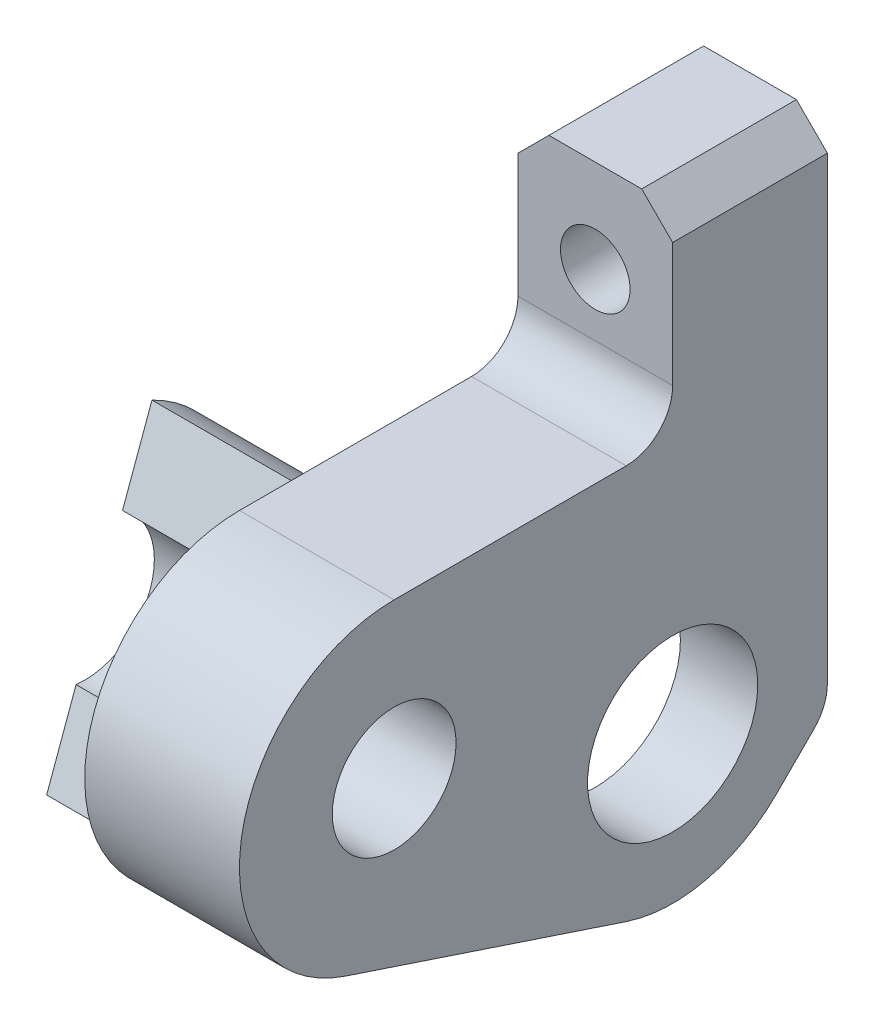
ISO-10303-21;
HEADER;
FILE_DESCRIPTION(('STEP AP214'),'2;1');
FILE_NAME('part.step','',(''),(''),'','','');
FILE_SCHEMA(('AUTOMOTIVE_DESIGN { 1 0 10303 214 1 1 1 1 }'));
ENDSEC;
DATA;
#1=APPLICATION_CONTEXT('core data for automotive mechanical design processes');
#2=APPLICATION_PROTOCOL_DEFINITION('international standard','automotive_design',2000,#1);
#3=PRODUCT_CONTEXT('',#1,'mechanical');
#4=PRODUCT('Part','Part','',(#3));
#5=PRODUCT_RELATED_PRODUCT_CATEGORY('part','',(#4));
#6=PRODUCT_DEFINITION_FORMATION('','',#4);
#7=PRODUCT_DEFINITION_CONTEXT('part definition',#1,'design');
#8=PRODUCT_DEFINITION('design','',#6,#7);
#9=PRODUCT_DEFINITION_SHAPE('','',#8);
#10=(LENGTH_UNIT() NAMED_UNIT(*) SI_UNIT(.MILLI.,.METRE.));
#11=(NAMED_UNIT(*) PLANE_ANGLE_UNIT() SI_UNIT($,.RADIAN.));
#12=(NAMED_UNIT(*) SI_UNIT($,.STERADIAN.) SOLID_ANGLE_UNIT());
#13=UNCERTAINTY_MEASURE_WITH_UNIT(LENGTH_MEASURE(1.E-05),#10,'distance_accuracy_value','');
#14=(GEOMETRIC_REPRESENTATION_CONTEXT(3) GLOBAL_UNCERTAINTY_ASSIGNED_CONTEXT((#13)) GLOBAL_UNIT_ASSIGNED_CONTEXT((#10,
#11,#12)) REPRESENTATION_CONTEXT('',''));
#15=CARTESIAN_POINT('',(0.,0.,0.));
#16=DIRECTION('',(0.,0.,1.));
#17=DIRECTION('',(1.,0.,0.));
#18=AXIS2_PLACEMENT_3D('',#15,#16,#17);
#19=CARTESIAN_POINT('',(-7.5,0.,0.));
#20=DIRECTION('',(1.,0.,0.));
#21=DIRECTION('',(0.,0.,1.));
#22=AXIS2_PLACEMENT_3D('',#19,#20,#21);
#23=PLANE('',#22);
#24=CARTESIAN_POINT('',(-7.5,0.,0.));
#25=DIRECTION('',(-1.,0.,0.));
#26=DIRECTION('',(0.,0.,1.));
#27=AXIS2_PLACEMENT_3D('',#24,#25,#26);
#28=CIRCLE('',#27,4.);
#29=CARTESIAN_POINT('',(-7.5,0.,4.));
#30=VERTEX_POINT('',#29);
#31=EDGE_CURVE('E352',#30,#30,#28,.T.);
#32=ORIENTED_EDGE('',*,*,#31,.F.);
#33=EDGE_LOOP('',(#32));
#34=FACE_BOUND('',#33,.T.);
#35=CARTESIAN_POINT('',(-7.5,0.,0.));
#36=DIRECTION('',(1.,0.,0.));
#37=DIRECTION('',(0.,0.,-1.));
#38=AXIS2_PLACEMENT_3D('',#35,#36,#37);
#39=CIRCLE('',#38,10.);
#40=CARTESIAN_POINT('',(-7.5,4.17319289451121,-9.0875993015318));
#41=VERTEX_POINT('',#40);
#42=CARTESIAN_POINT('',(-7.5,9.00780338091209,-4.34275007925034));
#43=VERTEX_POINT('',#42);
#44=EDGE_CURVE('E262',#41,#43,#39,.T.);
#45=ORIENTED_EDGE('',*,*,#44,.T.);
#46=DIRECTION('',(0.,-0.93969262078591,0.342020143325665));
#47=VECTOR('',#46,1.);
#48=CARTESIAN_POINT('',(-7.5,-0.342020143325665,-0.93969262078591));
#49=LINE('',#48,#47);
#50=CARTESIAN_POINT('',(-7.5,3.7808644979201,-2.44029990951264));
#51=VERTEX_POINT('',#50);
#52=EDGE_CURVE('E259',#43,#51,#49,.T.);
#53=ORIENTED_EDGE('',*,*,#52,.T.);
#54=CARTESIAN_POINT('',(-7.5,0.,0.));
#55=DIRECTION('',(1.,0.,0.));
#56=DIRECTION('',(0.,0.,-1.));
#57=AXIS2_PLACEMENT_3D('',#54,#55,#56);
#58=CIRCLE('',#57,4.5);
#59=CARTESIAN_POINT('',(-7.5,-4.46490478457143,0.560914667940823));
#60=VERTEX_POINT('',#59);
#61=EDGE_CURVE('E278',#60,#51,#58,.T.);
#62=ORIENTED_EDGE('',*,*,#61,.F.);
#63=DIRECTION('',(0.,-0.93969262078591,0.342020143325666));
#64=VECTOR('',#63,1.);
#65=CARTESIAN_POINT('',(-7.5,-0.342020143325666,-0.93969262078591));
#66=LINE('',#65,#64);
#67=CARTESIAN_POINT('',(-7.5,-9.69184366756342,2.46336483767852));
#68=VERTEX_POINT('',#67);
#69=EDGE_CURVE('E252',#60,#68,#66,.T.);
#70=ORIENTED_EDGE('',*,*,#69,.T.);
#71=CARTESIAN_POINT('',(-7.5,0.,0.));
#72=DIRECTION('',(-1.,0.,0.));
#73=DIRECTION('',(0.,0.,1.));
#74=AXIS2_PLACEMENT_3D('',#71,#72,#73);
#75=CIRCLE('',#74,10.);
#76=CARTESIAN_POINT('',(-7.5,10.,0.));
#77=VERTEX_POINT('',#76);
#78=EDGE_CURVE('E360',#68,#77,#75,.T.);
#79=ORIENTED_EDGE('',*,*,#78,.T.);
#80=DIRECTION('',(0.,0.,-1.));
#81=VECTOR('',#80,1.);
#82=CARTESIAN_POINT('',(-7.5,10.,0.));
#83=LINE('',#82,#81);
#84=CARTESIAN_POINT('',(-7.5,10.,-15.));
#85=VERTEX_POINT('',#84);
#86=EDGE_CURVE('E358',#77,#85,#83,.T.);
#87=ORIENTED_EDGE('',*,*,#86,.T.);
#88=CARTESIAN_POINT('',(-7.5,13.,-15.));
#89=DIRECTION('',(1.,0.,0.));
#90=DIRECTION('',(0.,0.,-1.));
#91=AXIS2_PLACEMENT_3D('',#88,#89,#90);
#92=CIRCLE('',#91,3.);
#93=CARTESIAN_POINT('',(-7.5,13.,-18.));
#94=VERTEX_POINT('',#93);
#95=EDGE_CURVE('E586',#85,#94,#92,.T.);
#96=ORIENTED_EDGE('',*,*,#95,.T.);
#97=DIRECTION('',(0.,1.,0.));
#98=VECTOR('',#97,1.);
#99=CARTESIAN_POINT('',(-7.5,13.,-18.));
#100=LINE('',#99,#98);
#101=CARTESIAN_POINT('',(-7.5,21.,-18.));
#102=VERTEX_POINT('',#101);
#103=EDGE_CURVE('E582',#94,#102,#100,.T.);
#104=ORIENTED_EDGE('',*,*,#103,.T.);
#105=DIRECTION('',(0.,0.,1.));
#106=VECTOR('',#105,1.);
#107=CARTESIAN_POINT('',(-7.5,21.,0.));
#108=LINE('',#107,#106);
#109=CARTESIAN_POINT('',(-7.5,21.,-28.));
#110=VERTEX_POINT('',#109);
#111=EDGE_CURVE('E426',#110,#102,#108,.T.);
#112=ORIENTED_EDGE('',*,*,#111,.F.);
#113=DIRECTION('',(0.,-1.,0.));
#114=VECTOR('',#113,1.);
#115=CARTESIAN_POINT('',(-7.5,23.,-28.));
#116=LINE('',#115,#114);
#117=CARTESIAN_POINT('',(-7.5,9.,-28.));
#118=VERTEX_POINT('',#117);
#119=EDGE_CURVE('E577',#110,#118,#116,.T.);
#120=ORIENTED_EDGE('',*,*,#119,.T.);
#121=CARTESIAN_POINT('',(-7.5,9.,-26.));
#122=DIRECTION('',(-1.,0.,0.));
#123=DIRECTION('',(0.,0.,1.));
#124=AXIS2_PLACEMENT_3D('',#121,#122,#123);
#125=CIRCLE('',#124,2.);
#126=CARTESIAN_POINT('',(-7.5,7.,-26.));
#127=VERTEX_POINT('',#126);
#128=EDGE_CURVE('E581',#118,#127,#125,.T.);
#129=ORIENTED_EDGE('',*,*,#128,.T.);
#130=DIRECTION('',(0.,0.,1.));
#131=VECTOR('',#130,1.);
#132=CARTESIAN_POINT('',(-7.5,7.,-26.));
#133=LINE('',#132,#131);
#134=CARTESIAN_POINT('',(-7.5,7.,-10.9087121146357));
#135=VERTEX_POINT('',#134);
#136=EDGE_CURVE('E590',#127,#135,#133,.T.);
#137=ORIENTED_EDGE('',*,*,#136,.T.);
#138=CARTESIAN_POINT('',(-7.5,5.,-10.9087121146357));
#139=DIRECTION('',(1.,0.,0.));
#140=DIRECTION('',(0.,0.,-1.));
#141=AXIS2_PLACEMENT_3D('',#138,#139,#140);
#142=CIRCLE('',#141,2.);
#143=CARTESIAN_POINT('',(-7.5,4.17925682034681,-9.08487532559652));
#144=VERTEX_POINT('',#143);
#145=EDGE_CURVE('E387',#135,#144,#142,.T.);
#146=ORIENTED_EDGE('',*,*,#145,.T.);
#147=CARTESIAN_POINT('',(-7.5,2.12739887121385,-4.52528335299855));
#148=DIRECTION('',(-1.,0.,0.));
#149=DIRECTION('',(0.,0.,1.));
#150=AXIS2_PLACEMENT_3D('',#147,#148,#149);
#151=CIRCLE('',#150,5.);
#152=EDGE_CURVE('E285',#41,#144,#151,.F.);
#153=ORIENTED_EDGE('',*,*,#152,.F.);
#154=EDGE_LOOP('',(#45,#53,#62,#70,#79,#87,#96,#104,#112,#120,#129,#137,#146,#153));
#155=FACE_BOUND('',#154,.T.);
#156=ADVANCED_FACE('F37',(#34,#155),#23,.F.);
#157=CARTESIAN_POINT('',(-2.5,17.,-28.00005));
#158=DIRECTION('',(0.,0.,1.));
#159=DIRECTION('',(-1.,0.,0.));
#160=AXIS2_PLACEMENT_3D('',#157,#158,#159);
#161=CYLINDRICAL_SURFACE('',#160,2.25);
#162=CARTESIAN_POINT('',(-2.5,17.,-18.));
#163=DIRECTION('',(0.,0.,-1.));
#164=DIRECTION('',(-1.,0.,0.));
#165=AXIS2_PLACEMENT_3D('',#162,#163,#164);
#166=CIRCLE('',#165,2.25);
#167=CARTESIAN_POINT('',(-4.75,17.,-18.));
#168=VERTEX_POINT('',#167);
#169=EDGE_CURVE('E349',#168,#168,#166,.T.);
#170=ORIENTED_EDGE('',*,*,#169,.F.);
#171=EDGE_LOOP('',(#170));
#172=FACE_BOUND('',#171,.T.);
#173=CARTESIAN_POINT('',(-2.5,17.,-22.));
#174=DIRECTION('',(0.,0.,1.));
#175=DIRECTION('',(1.,0.,0.));
#176=AXIS2_PLACEMENT_3D('',#173,#174,#175);
#177=CIRCLE('',#176,2.25);
#178=CARTESIAN_POINT('',(-0.250000000000001,17.,-22.));
#179=VERTEX_POINT('',#178);
#180=EDGE_CURVE('E339',#179,#179,#177,.F.);
#181=ORIENTED_EDGE('',*,*,#180,.T.);
#182=EDGE_LOOP('',(#181));
#183=FACE_BOUND('',#182,.T.);
#184=ADVANCED_FACE('F468',(#172,#183),#161,.F.);
#185=CARTESIAN_POINT('',(-2.5,0.,0.));
#186=DIRECTION('',(-1.,0.,0.));
#187=DIRECTION('',(0.,0.,-1.));
#188=AXIS2_PLACEMENT_3D('',#185,#186,#187);
#189=PLANE('',#188);
#190=CARTESIAN_POINT('',(-2.5,-6.5,-18.));
#191=DIRECTION('',(1.,0.,0.));
#192=DIRECTION('',(0.,0.,-1.));
#193=AXIS2_PLACEMENT_3D('',#190,#191,#192);
#194=CIRCLE('',#193,5.5);
#195=CARTESIAN_POINT('',(-2.5,-6.5,-23.5));
#196=VERTEX_POINT('',#195);
#197=EDGE_CURVE('E602',#196,#196,#194,.T.);
#198=ORIENTED_EDGE('',*,*,#197,.T.);
#199=EDGE_LOOP('',(#198));
#200=FACE_BOUND('',#199,.T.);
#201=CARTESIAN_POINT('',(-2.5,5.,-10.9087121146357));
#202=DIRECTION('',(1.,0.,0.));
#203=DIRECTION('',(0.,0.,-1.));
#204=AXIS2_PLACEMENT_3D('',#201,#202,#203);
#205=CIRCLE('',#204,2.);
#206=CARTESIAN_POINT('',(-2.5,7.,-10.9087121146357));
#207=VERTEX_POINT('',#206);
#208=CARTESIAN_POINT('',(-2.5,4.17925682034681,-9.08487532559652));
#209=VERTEX_POINT('',#208);
#210=EDGE_CURVE('E442',#207,#209,#205,.T.);
#211=ORIENTED_EDGE('',*,*,#210,.F.);
#212=DIRECTION('',(0.,0.,1.));
#213=VECTOR('',#212,1.);
#214=CARTESIAN_POINT('',(-2.5,7.,-26.));
#215=LINE('',#214,#213);
#216=CARTESIAN_POINT('',(-2.5,7.,-26.));
#217=VERTEX_POINT('',#216);
#218=EDGE_CURVE('E392',#217,#207,#215,.T.);
#219=ORIENTED_EDGE('',*,*,#218,.F.);
#220=CARTESIAN_POINT('',(-2.5,9.,-26.));
#221=DIRECTION('',(-1.,0.,0.));
#222=DIRECTION('',(0.,0.,1.));
#223=AXIS2_PLACEMENT_3D('',#220,#221,#222);
#224=CIRCLE('',#223,2.);
#225=CARTESIAN_POINT('',(-2.5,9.,-28.));
#226=VERTEX_POINT('',#225);
#227=EDGE_CURVE('E376',#226,#217,#224,.T.);
#228=ORIENTED_EDGE('',*,*,#227,.F.);
#229=DIRECTION('',(0.,1.,0.));
#230=VECTOR('',#229,1.);
#231=CARTESIAN_POINT('',(-2.5,23.,-28.));
#232=LINE('',#231,#230);
#233=CARTESIAN_POINT('',(-2.5,-8.69238815542512,-28.));
#234=VERTEX_POINT('',#233);
#235=EDGE_CURVE('E381',#234,#226,#232,.T.);
#236=ORIENTED_EDGE('',*,*,#235,.F.);
#237=CARTESIAN_POINT('',(-2.5,-8.69238815542512,-25.));
#238=DIRECTION('',(1.,0.,0.));
#239=DIRECTION('',(0.,0.,1.));
#240=AXIS2_PLACEMENT_3D('',#237,#238,#239);
#241=CIRCLE('',#240,3.);
#242=CARTESIAN_POINT('',(-2.5,-10.8137084989848,-27.1213203435596));
#243=VERTEX_POINT('',#242);
#244=EDGE_CURVE('E616',#243,#234,#241,.T.);
#245=ORIENTED_EDGE('',*,*,#244,.F.);
#246=DIRECTION('',(0.,0.707106781186545,-0.70710678118655));
#247=VECTOR('',#246,1.);
#248=CARTESIAN_POINT('',(-2.5,-10.8137084989848,-27.1213203435596));
#249=LINE('',#248,#247);
#250=CARTESIAN_POINT('',(-2.5,-13.2175144212722,-24.7175144212722));
#251=VERTEX_POINT('',#250);
#252=EDGE_CURVE('E613',#251,#243,#249,.T.);
#253=ORIENTED_EDGE('',*,*,#252,.F.);
#254=CARTESIAN_POINT('',(-2.5,-6.5,-18.));
#255=DIRECTION('',(1.,0.,0.));
#256=DIRECTION('',(0.,0.,-1.));
#257=AXIS2_PLACEMENT_3D('',#254,#255,#256);
#258=CIRCLE('',#257,9.5);
#259=CARTESIAN_POINT('',(-2.5,-15.5165122902942,-15.0079261173938));
#260=VERTEX_POINT('',#259);
#261=EDGE_CURVE('E398',#260,#251,#258,.T.);
#262=ORIENTED_EDGE('',*,*,#261,.F.);
#263=DIRECTION('',(0.,-0.314955145537498,-0.94910655687307));
#264=VECTOR('',#263,1.);
#265=CARTESIAN_POINT('',(-2.5,-9.49106556873069,3.14955145537497));
#266=LINE('',#265,#264);
#267=CARTESIAN_POINT('',(-2.5,-9.4910655687307,3.14955145537498));
#268=VERTEX_POINT('',#267);
#269=EDGE_CURVE('E395',#268,#260,#266,.T.);
#270=ORIENTED_EDGE('',*,*,#269,.F.);
#271=CARTESIAN_POINT('',(-2.5,0.,0.));
#272=DIRECTION('',(-1.,0.,0.));
#273=DIRECTION('',(0.,0.,1.));
#274=AXIS2_PLACEMENT_3D('',#271,#272,#273);
#275=CIRCLE('',#274,10.);
#276=CARTESIAN_POINT('',(-2.5,-9.05468116083169,-4.24414291414412));
#277=VERTEX_POINT('',#276);
#278=EDGE_CURVE('E355',#277,#268,#275,.T.);
#279=ORIENTED_EDGE('',*,*,#278,.F.);
#280=CARTESIAN_POINT('',(-2.5,-4.52734058041584,-2.12207145707206));
#281=DIRECTION('',(1.,0.,0.));
#282=DIRECTION('',(0.,0.,-1.));
#283=AXIS2_PLACEMENT_3D('',#280,#281,#282);
#284=CIRCLE('',#283,5.);
#285=CARTESIAN_POINT('',(-2.5,-5.14379664903589,-7.08392412673704));
#286=VERTEX_POINT('',#285);
#287=EDGE_CURVE('E46',#286,#277,#284,.F.);
#288=ORIENTED_EDGE('',*,*,#287,.F.);
#289=CARTESIAN_POINT('',(-2.5,-6.5,-18.));
#290=DIRECTION('',(1.,0.,0.));
#291=DIRECTION('',(0.,0.,1.));
#292=AXIS2_PLACEMENT_3D('',#289,#290,#291);
#293=CIRCLE('',#292,11.);
#294=CARTESIAN_POINT('',(-2.5,-0.568663276040478,-8.7361323051865));
#295=VERTEX_POINT('',#294);
#296=EDGE_CURVE('E362',#295,#286,#293,.T.);
#297=ORIENTED_EDGE('',*,*,#296,.F.);
#298=CARTESIAN_POINT('',(-2.5,2.12739887121385,-4.52528335299855));
#299=DIRECTION('',(1.,0.,0.));
#300=DIRECTION('',(0.,0.,-1.));
#301=AXIS2_PLACEMENT_3D('',#298,#299,#300);
#302=CIRCLE('',#301,5.);
#303=EDGE_CURVE('E11',#209,#295,#302,.F.);
#304=ORIENTED_EDGE('',*,*,#303,.F.);
#305=EDGE_LOOP('',(#211,#219,#228,#236,#245,#253,#262,#270,#279,#288,#297,#304));
#306=FACE_BOUND('',#305,.T.);
#307=ADVANCED_FACE('F445',(#200,#306),#189,.T.);
#308=CARTESIAN_POINT('',(2.5,0.,0.));
#309=DIRECTION('',(-1.,0.,0.));
#310=DIRECTION('',(0.,0.,-1.));
#311=AXIS2_PLACEMENT_3D('',#308,#309,#310);
#312=PLANE('',#311);
#313=CARTESIAN_POINT('',(2.5,0.,0.));
#314=DIRECTION('',(1.,0.,0.));
#315=DIRECTION('',(0.,0.,-1.));
#316=AXIS2_PLACEMENT_3D('',#313,#314,#315);
#317=CIRCLE('',#316,4.);
#318=CARTESIAN_POINT('',(2.5,0.,-4.));
#319=VERTEX_POINT('',#318);
#320=EDGE_CURVE('E605',#319,#319,#317,.T.);
#321=ORIENTED_EDGE('',*,*,#320,.F.);
#322=EDGE_LOOP('',(#321));
#323=FACE_BOUND('',#322,.T.);
#324=DIRECTION('',(0.,-1.,0.));
#325=VECTOR('',#324,1.);
#326=CARTESIAN_POINT('',(2.5,23.,-18.));
#327=LINE('',#326,#325);
#328=CARTESIAN_POINT('',(2.5,21.,-18.));
#329=VERTEX_POINT('',#328);
#330=CARTESIAN_POINT('',(2.5,13.,-18.));
#331=VERTEX_POINT('',#330);
#332=EDGE_CURVE('E637',#329,#331,#327,.T.);
#333=ORIENTED_EDGE('',*,*,#332,.T.);
#334=CARTESIAN_POINT('',(2.5,13.,-15.));
#335=DIRECTION('',(-1.,0.,0.));
#336=DIRECTION('',(0.,0.,-1.));
#337=AXIS2_PLACEMENT_3D('',#334,#335,#336);
#338=CIRCLE('',#337,3.);
#339=CARTESIAN_POINT('',(2.5,10.,-15.));
#340=VERTEX_POINT('',#339);
#341=EDGE_CURVE('E640',#331,#340,#338,.T.);
#342=ORIENTED_EDGE('',*,*,#341,.T.);
#343=DIRECTION('',(0.,0.,1.));
#344=VECTOR('',#343,1.);
#345=CARTESIAN_POINT('',(2.5,10.,0.));
#346=LINE('',#345,#344);
#347=CARTESIAN_POINT('',(2.5,10.,0.));
#348=VERTEX_POINT('',#347);
#349=EDGE_CURVE('E399',#340,#348,#346,.T.);
#350=ORIENTED_EDGE('',*,*,#349,.T.);
#351=CARTESIAN_POINT('',(2.5,0.,0.));
#352=DIRECTION('',(1.,0.,0.));
#353=DIRECTION('',(0.,0.,-1.));
#354=AXIS2_PLACEMENT_3D('',#351,#352,#353);
#355=CIRCLE('',#354,10.);
#356=CARTESIAN_POINT('',(2.5,-9.49106556873069,3.14955145537497));
#357=VERTEX_POINT('',#356);
#358=EDGE_CURVE('E610',#348,#357,#355,.T.);
#359=ORIENTED_EDGE('',*,*,#358,.T.);
#360=DIRECTION('',(0.,-0.314955145537498,-0.94910655687307));
#361=VECTOR('',#360,1.);
#362=CARTESIAN_POINT('',(2.5,-9.49106556873069,3.14955145537497));
#363=LINE('',#362,#361);
#364=CARTESIAN_POINT('',(2.5,-15.5165122902942,-15.0079261173938));
#365=VERTEX_POINT('',#364);
#366=EDGE_CURVE('E622',#357,#365,#363,.T.);
#367=ORIENTED_EDGE('',*,*,#366,.T.);
#368=CARTESIAN_POINT('',(2.5,-6.5,-18.));
#369=DIRECTION('',(1.,0.,0.));
#370=DIRECTION('',(0.,0.,-1.));
#371=AXIS2_PLACEMENT_3D('',#368,#369,#370);
#372=CIRCLE('',#371,9.5);
#373=CARTESIAN_POINT('',(2.5,-13.2175144212722,-24.7175144212722));
#374=VERTEX_POINT('',#373);
#375=EDGE_CURVE('E625',#365,#374,#372,.T.);
#376=ORIENTED_EDGE('',*,*,#375,.T.);
#377=DIRECTION('',(0.,0.707106781186545,-0.70710678118655));
#378=VECTOR('',#377,1.);
#379=CARTESIAN_POINT('',(2.5,-10.8137084989848,-27.1213203435596));
#380=LINE('',#379,#378);
#381=CARTESIAN_POINT('',(2.5,-10.8137084989848,-27.1213203435596));
#382=VERTEX_POINT('',#381);
#383=EDGE_CURVE('E628',#374,#382,#380,.T.);
#384=ORIENTED_EDGE('',*,*,#383,.T.);
#385=CARTESIAN_POINT('',(2.5,-8.69238815542512,-25.));
#386=DIRECTION('',(1.,0.,0.));
#387=DIRECTION('',(0.,0.,1.));
#388=AXIS2_PLACEMENT_3D('',#385,#386,#387);
#389=CIRCLE('',#388,3.);
#390=CARTESIAN_POINT('',(2.5,-8.69238815542512,-28.));
#391=VERTEX_POINT('',#390);
#392=EDGE_CURVE('E631',#382,#391,#389,.T.);
#393=ORIENTED_EDGE('',*,*,#392,.T.);
#394=DIRECTION('',(0.,1.,0.));
#395=VECTOR('',#394,1.);
#396=CARTESIAN_POINT('',(2.5,23.,-28.));
#397=LINE('',#396,#395);
#398=CARTESIAN_POINT('',(2.5,21.,-28.));
#399=VERTEX_POINT('',#398);
#400=EDGE_CURVE('E634',#391,#399,#397,.T.);
#401=ORIENTED_EDGE('',*,*,#400,.T.);
#402=DIRECTION('',(0.,0.,-1.));
#403=VECTOR('',#402,1.);
#404=CARTESIAN_POINT('',(2.5,21.,0.));
#405=LINE('',#404,#403);
#406=EDGE_CURVE('E418',#329,#399,#405,.T.);
#407=ORIENTED_EDGE('',*,*,#406,.F.);
#408=EDGE_LOOP('',(#333,#342,#350,#359,#367,#376,#384,#393,#401,#407));
#409=FACE_BOUND('',#408,.T.);
#410=CARTESIAN_POINT('',(2.5,-6.5,-18.));
#411=DIRECTION('',(1.,0.,0.));
#412=DIRECTION('',(0.,0.,-1.));
#413=AXIS2_PLACEMENT_3D('',#410,#411,#412);
#414=CIRCLE('',#413,5.5);
#415=CARTESIAN_POINT('',(2.5,-6.5,-23.5));
#416=VERTEX_POINT('',#415);
#417=EDGE_CURVE('E600',#416,#416,#414,.T.);
#418=ORIENTED_EDGE('',*,*,#417,.F.);
#419=EDGE_LOOP('',(#418));
#420=FACE_BOUND('',#419,.T.);
#421=ADVANCED_FACE('F505',(#323,#409,#420),#312,.F.);
#422=CARTESIAN_POINT('',(-2.5,0.,0.));
#423=DIRECTION('',(1.,0.,0.));
#424=DIRECTION('',(0.,0.,1.));
#425=AXIS2_PLACEMENT_3D('',#422,#423,#424);
#426=CYLINDRICAL_SURFACE('',#425,10.);
#427=ORIENTED_EDGE('',*,*,#278,.T.);
#428=DIRECTION('',(1.,0.,0.));
#429=VECTOR('',#428,1.);
#430=CARTESIAN_POINT('',(-2.5,-9.49106556873069,3.14955145537497));
#431=LINE('',#430,#429);
#432=EDGE_CURVE('E402',#268,#357,#431,.T.);
#433=ORIENTED_EDGE('',*,*,#432,.T.);
#434=ORIENTED_EDGE('',*,*,#358,.F.);
#435=DIRECTION('',(1.,0.,0.));
#436=VECTOR('',#435,1.);
#437=CARTESIAN_POINT('',(-2.5,10.,0.));
#438=LINE('',#437,#436);
#439=EDGE_CURVE('E453',#77,#348,#438,.T.);
#440=ORIENTED_EDGE('',*,*,#439,.F.);
#441=ORIENTED_EDGE('',*,*,#78,.F.);
#442=DIRECTION('',(1.,0.,0.));
#443=VECTOR('',#442,1.);
#444=CARTESIAN_POINT('',(-17.5,-9.69184366756342,2.46336483767852));
#445=LINE('',#444,#443);
#446=CARTESIAN_POINT('',(-17.5,-9.69184366756342,2.46336483767852));
#447=VERTEX_POINT('',#446);
#448=EDGE_CURVE('E256',#447,#68,#445,.T.);
#449=ORIENTED_EDGE('',*,*,#448,.F.);
#450=CARTESIAN_POINT('',(-17.5,0.,0.));
#451=DIRECTION('',(1.,0.,0.));
#452=DIRECTION('',(0.,0.,-1.));
#453=AXIS2_PLACEMENT_3D('',#450,#451,#452);
#454=CIRCLE('',#453,10.);
#455=CARTESIAN_POINT('',(-17.5,-9.05468116083168,-4.24414291414412));
#456=VERTEX_POINT('',#455);
#457=EDGE_CURVE('E244',#447,#456,#454,.T.);
#458=ORIENTED_EDGE('',*,*,#457,.T.);
#459=DIRECTION('',(1.,0.,0.));
#460=VECTOR('',#459,1.);
#461=CARTESIAN_POINT('',(-2.5,-9.05468116083169,-4.24414291414412));
#462=LINE('',#461,#460);
#463=EDGE_CURVE('E369',#277,#456,#462,.F.);
#464=ORIENTED_EDGE('',*,*,#463,.F.);
#465=EDGE_LOOP('',(#427,#433,#434,#440,#441,#449,#458,#464));
#466=FACE_BOUND('',#465,.T.);
#467=ADVANCED_FACE('F449',(#466),#426,.T.);
#468=CARTESIAN_POINT('',(-2.5,-9.49106556873069,3.14955145537497));
#469=DIRECTION('',(0.,0.94910655687307,-0.314955145537498));
#470=DIRECTION('',(0.,0.314955145537498,0.94910655687307));
#471=AXIS2_PLACEMENT_3D('',#468,#469,#470);
#472=PLANE('',#471);
#473=ORIENTED_EDGE('',*,*,#366,.F.);
#474=ORIENTED_EDGE('',*,*,#432,.F.);
#475=ORIENTED_EDGE('',*,*,#269,.T.);
#476=DIRECTION('',(1.,0.,0.));
#477=VECTOR('',#476,1.);
#478=CARTESIAN_POINT('',(-2.5,-15.5165122902942,-15.0079261173938));
#479=LINE('',#478,#477);
#480=EDGE_CURVE('E405',#260,#365,#479,.T.);
#481=ORIENTED_EDGE('',*,*,#480,.T.);
#482=EDGE_LOOP('',(#473,#474,#475,#481));
#483=FACE_BOUND('',#482,.T.);
#484=ADVANCED_FACE('F540',(#483),#472,.F.);
#485=CARTESIAN_POINT('',(-2.5,-6.5,-18.));
#486=DIRECTION('',(1.,0.,0.));
#487=DIRECTION('',(0.,0.,1.));
#488=AXIS2_PLACEMENT_3D('',#485,#486,#487);
#489=CYLINDRICAL_SURFACE('',#488,9.5);
#490=ORIENTED_EDGE('',*,*,#375,.F.);
#491=ORIENTED_EDGE('',*,*,#480,.F.);
#492=ORIENTED_EDGE('',*,*,#261,.T.);
#493=DIRECTION('',(1.,0.,0.));
#494=VECTOR('',#493,1.);
#495=CARTESIAN_POINT('',(-2.5,-13.2175144212722,-24.7175144212722));
#496=LINE('',#495,#494);
#497=EDGE_CURVE('E652',#251,#374,#496,.T.);
#498=ORIENTED_EDGE('',*,*,#497,.T.);
#499=EDGE_LOOP('',(#490,#491,#492,#498));
#500=FACE_BOUND('',#499,.T.);
#501=ADVANCED_FACE('F536',(#500),#489,.T.);
#502=CARTESIAN_POINT('',(-2.5,-10.8137084989848,-27.1213203435596));
#503=DIRECTION('',(0.,0.70710678118655,0.707106781186545));
#504=DIRECTION('',(0.,-0.707106781186545,0.70710678118655));
#505=AXIS2_PLACEMENT_3D('',#502,#503,#504);
#506=PLANE('',#505);
#507=ORIENTED_EDGE('',*,*,#383,.F.);
#508=ORIENTED_EDGE('',*,*,#497,.F.);
#509=ORIENTED_EDGE('',*,*,#252,.T.);
#510=DIRECTION('',(1.,0.,0.));
#511=VECTOR('',#510,1.);
#512=CARTESIAN_POINT('',(-2.5,-10.8137084989848,-27.1213203435596));
#513=LINE('',#512,#511);
#514=EDGE_CURVE('E650',#243,#382,#513,.T.);
#515=ORIENTED_EDGE('',*,*,#514,.T.);
#516=EDGE_LOOP('',(#507,#508,#509,#515));
#517=FACE_BOUND('',#516,.T.);
#518=ADVANCED_FACE('F532',(#517),#506,.F.);
#519=CARTESIAN_POINT('',(-2.5,-8.69238815542512,-25.));
#520=DIRECTION('',(1.,0.,0.));
#521=DIRECTION('',(0.,0.,1.));
#522=AXIS2_PLACEMENT_3D('',#519,#520,#521);
#523=CYLINDRICAL_SURFACE('',#522,3.);
#524=ORIENTED_EDGE('',*,*,#392,.F.);
#525=ORIENTED_EDGE('',*,*,#514,.F.);
#526=ORIENTED_EDGE('',*,*,#244,.T.);
#527=DIRECTION('',(1.,0.,0.));
#528=VECTOR('',#527,1.);
#529=CARTESIAN_POINT('',(-2.5,-8.69238815542512,-28.));
#530=LINE('',#529,#528);
#531=EDGE_CURVE('E572',#234,#391,#530,.T.);
#532=ORIENTED_EDGE('',*,*,#531,.T.);
#533=EDGE_LOOP('',(#524,#525,#526,#532));
#534=FACE_BOUND('',#533,.T.);
#535=ADVANCED_FACE('F528',(#534),#523,.T.);
#536=CARTESIAN_POINT('',(-2.5,23.,-28.));
#537=DIRECTION('',(0.,0.,1.));
#538=DIRECTION('',(-1.,0.,0.));
#539=AXIS2_PLACEMENT_3D('',#536,#537,#538);
#540=PLANE('',#539);
#541=DIRECTION('',(0.866025403784438,-0.5,0.));
#542=VECTOR('',#541,1.);
#543=CARTESIAN_POINT('',(-6.05,14.9504065443768,-28.));
#544=LINE('',#543,#542);
#545=CARTESIAN_POINT('',(-6.05,14.9504065443768,-28.));
#546=VERTEX_POINT('',#545);
#547=CARTESIAN_POINT('',(-2.5,12.9008130887537,-28.));
#548=VERTEX_POINT('',#547);
#549=EDGE_CURVE('E323',#546,#548,#544,.T.);
#550=ORIENTED_EDGE('',*,*,#549,.T.);
#551=DIRECTION('',(0.866025403784439,0.499999999999999,0.));
#552=VECTOR('',#551,1.);
#553=CARTESIAN_POINT('',(-2.5,12.9008130887537,-28.));
#554=LINE('',#553,#552);
#555=CARTESIAN_POINT('',(1.05,14.9504065443768,-28.));
#556=VERTEX_POINT('',#555);
#557=EDGE_CURVE('E326',#548,#556,#554,.T.);
#558=ORIENTED_EDGE('',*,*,#557,.T.);
#559=DIRECTION('',(0.,1.,0.));
#560=VECTOR('',#559,1.);
#561=CARTESIAN_POINT('',(1.05,14.9504065443768,-28.));
#562=LINE('',#561,#560);
#563=CARTESIAN_POINT('',(1.05,19.0495934556232,-28.));
#564=VERTEX_POINT('',#563);
#565=EDGE_CURVE('E329',#556,#564,#562,.T.);
#566=ORIENTED_EDGE('',*,*,#565,.T.);
#567=DIRECTION('',(-0.866025403784438,0.5,0.));
#568=VECTOR('',#567,1.);
#569=CARTESIAN_POINT('',(1.05,19.0495934556232,-28.));
#570=LINE('',#569,#568);
#571=CARTESIAN_POINT('',(-2.5,21.0991869112463,-28.));
#572=VERTEX_POINT('',#571);
#573=EDGE_CURVE('E332',#564,#572,#570,.T.);
#574=ORIENTED_EDGE('',*,*,#573,.T.);
#575=DIRECTION('',(-0.86602540378444,-0.499999999999999,0.));
#576=VECTOR('',#575,1.);
#577=CARTESIAN_POINT('',(-2.5,21.0991869112463,-28.));
#578=LINE('',#577,#576);
#579=CARTESIAN_POINT('',(-6.05,19.0495934556232,-28.));
#580=VERTEX_POINT('',#579);
#581=EDGE_CURVE('E305',#572,#580,#578,.T.);
#582=ORIENTED_EDGE('',*,*,#581,.T.);
#583=DIRECTION('',(0.,-1.,0.));
#584=VECTOR('',#583,1.);
#585=CARTESIAN_POINT('',(-6.05,19.0495934556232,-28.));
#586=LINE('',#585,#584);
#587=EDGE_CURVE('E255',#580,#546,#586,.T.);
#588=ORIENTED_EDGE('',*,*,#587,.T.);
#589=EDGE_LOOP('',(#550,#558,#566,#574,#582,#588));
#590=FACE_BOUND('',#589,.T.);
#591=ORIENTED_EDGE('',*,*,#400,.F.);
#592=ORIENTED_EDGE('',*,*,#531,.F.);
#593=ORIENTED_EDGE('',*,*,#235,.T.);
#594=DIRECTION('',(1.,0.,0.));
#595=VECTOR('',#594,1.);
#596=CARTESIAN_POINT('',(-7.5,9.,-28.));
#597=LINE('',#596,#595);
#598=EDGE_CURVE('E384',#118,#226,#597,.T.);
#599=ORIENTED_EDGE('',*,*,#598,.F.);
#600=ORIENTED_EDGE('',*,*,#119,.F.);
#601=DIRECTION('',(0.707106781186545,0.70710678118655,0.));
#602=VECTOR('',#601,1.);
#603=CARTESIAN_POINT('',(-5.50000000000001,23.,-28.));
#604=LINE('',#603,#602);
#605=CARTESIAN_POINT('',(-5.5,23.,-28.));
#606=VERTEX_POINT('',#605);
#607=EDGE_CURVE('E421',#606,#110,#604,.F.);
#608=ORIENTED_EDGE('',*,*,#607,.F.);
#609=DIRECTION('',(1.,0.,0.));
#610=VECTOR('',#609,1.);
#611=CARTESIAN_POINT('',(-2.5,23.,-28.));
#612=LINE('',#611,#610);
#613=CARTESIAN_POINT('',(0.500000000000005,23.,-28.));
#614=VERTEX_POINT('',#613);
#615=EDGE_CURVE('E566',#606,#614,#612,.T.);
#616=ORIENTED_EDGE('',*,*,#615,.T.);
#617=DIRECTION('',(0.707106781186545,-0.70710678118655,0.));
#618=VECTOR('',#617,1.);
#619=CARTESIAN_POINT('',(0.500000000000005,23.,-28.));
#620=LINE('',#619,#618);
#621=EDGE_CURVE('E423',#399,#614,#620,.F.);
#622=ORIENTED_EDGE('',*,*,#621,.F.);
#623=EDGE_LOOP('',(#591,#592,#593,#599,#600,#608,#616,#622));
#624=FACE_BOUND('',#623,.T.);
#625=ADVANCED_FACE('F524',(#590,#624),#540,.F.);
#626=CARTESIAN_POINT('',(-2.5,23.,-28.));
#627=DIRECTION('',(0.,-1.,0.));
#628=DIRECTION('',(0.,0.,-1.));
#629=AXIS2_PLACEMENT_3D('',#626,#627,#628);
#630=PLANE('',#629);
#631=ORIENTED_EDGE('',*,*,#615,.F.);
#632=DIRECTION('',(0.,0.,-1.));
#633=VECTOR('',#632,1.);
#634=CARTESIAN_POINT('',(-5.50000000000001,23.,-28.));
#635=LINE('',#634,#633);
#636=CARTESIAN_POINT('',(-5.5,23.,-18.));
#637=VERTEX_POINT('',#636);
#638=EDGE_CURVE('E404',#637,#606,#635,.T.);
#639=ORIENTED_EDGE('',*,*,#638,.F.);
#640=DIRECTION('',(1.,0.,0.));
#641=VECTOR('',#640,1.);
#642=CARTESIAN_POINT('',(-2.5,23.,-18.));
#643=LINE('',#642,#641);
#644=CARTESIAN_POINT('',(0.500000000000005,23.,-18.));
#645=VERTEX_POINT('',#644);
#646=EDGE_CURVE('E564',#637,#645,#643,.T.);
#647=ORIENTED_EDGE('',*,*,#646,.T.);
#648=DIRECTION('',(0.,0.,1.));
#649=VECTOR('',#648,1.);
#650=CARTESIAN_POINT('',(0.500000000000005,23.,-28.));
#651=LINE('',#650,#649);
#652=EDGE_CURVE('E411',#614,#645,#651,.T.);
#653=ORIENTED_EDGE('',*,*,#652,.F.);
#654=EDGE_LOOP('',(#631,#639,#647,#653));
#655=FACE_BOUND('',#654,.T.);
#656=ADVANCED_FACE('F520',(#655),#630,.F.);
#657=CARTESIAN_POINT('',(-2.5,23.,-18.));
#658=DIRECTION('',(0.,0.,-1.));
#659=DIRECTION('',(1.,0.,0.));
#660=AXIS2_PLACEMENT_3D('',#657,#658,#659);
#661=PLANE('',#660);
#662=ORIENTED_EDGE('',*,*,#169,.T.);
#663=EDGE_LOOP('',(#662));
#664=FACE_BOUND('',#663,.T.);
#665=ORIENTED_EDGE('',*,*,#646,.F.);
#666=DIRECTION('',(-0.707106781186545,-0.70710678118655,0.));
#667=VECTOR('',#666,1.);
#668=CARTESIAN_POINT('',(-5.50000000000001,23.,-18.));
#669=LINE('',#668,#667);
#670=EDGE_CURVE('E414',#102,#637,#669,.F.);
#671=ORIENTED_EDGE('',*,*,#670,.F.);
#672=ORIENTED_EDGE('',*,*,#103,.F.);
#673=DIRECTION('',(1.,0.,0.));
#674=VECTOR('',#673,1.);
#675=CARTESIAN_POINT('',(-2.5,13.,-18.));
#676=LINE('',#675,#674);
#677=EDGE_CURVE('E567',#94,#331,#676,.T.);
#678=ORIENTED_EDGE('',*,*,#677,.T.);
#679=ORIENTED_EDGE('',*,*,#332,.F.);
#680=DIRECTION('',(-0.707106781186545,0.70710678118655,0.));
#681=VECTOR('',#680,1.);
#682=CARTESIAN_POINT('',(0.500000000000005,23.,-18.));
#683=LINE('',#682,#681);
#684=EDGE_CURVE('E416',#645,#329,#683,.F.);
#685=ORIENTED_EDGE('',*,*,#684,.F.);
#686=EDGE_LOOP('',(#665,#671,#672,#678,#679,#685));
#687=FACE_BOUND('',#686,.T.);
#688=ADVANCED_FACE('F516',(#664,#687),#661,.F.);
#689=CARTESIAN_POINT('',(-2.5,13.,-15.));
#690=DIRECTION('',(1.,0.,0.));
#691=DIRECTION('',(0.,0.,1.));
#692=AXIS2_PLACEMENT_3D('',#689,#690,#691);
#693=CYLINDRICAL_SURFACE('',#692,3.);
#694=ORIENTED_EDGE('',*,*,#341,.F.);
#695=ORIENTED_EDGE('',*,*,#677,.F.);
#696=ORIENTED_EDGE('',*,*,#95,.F.);
#697=DIRECTION('',(1.,0.,0.));
#698=VECTOR('',#697,1.);
#699=CARTESIAN_POINT('',(-2.5,10.,-15.));
#700=LINE('',#699,#698);
#701=EDGE_CURVE('E646',#85,#340,#700,.T.);
#702=ORIENTED_EDGE('',*,*,#701,.T.);
#703=EDGE_LOOP('',(#694,#695,#696,#702));
#704=FACE_BOUND('',#703,.T.);
#705=ADVANCED_FACE('F512',(#704),#693,.F.);
#706=CARTESIAN_POINT('',(-2.5,10.,0.));
#707=DIRECTION('',(0.,-1.,0.));
#708=DIRECTION('',(0.,0.,-1.));
#709=AXIS2_PLACEMENT_3D('',#706,#707,#708);
#710=PLANE('',#709);
#711=ORIENTED_EDGE('',*,*,#349,.F.);
#712=ORIENTED_EDGE('',*,*,#701,.F.);
#713=ORIENTED_EDGE('',*,*,#86,.F.);
#714=ORIENTED_EDGE('',*,*,#439,.T.);
#715=EDGE_LOOP('',(#711,#712,#713,#714));
#716=FACE_BOUND('',#715,.T.);
#717=ADVANCED_FACE('F501',(#716),#710,.F.);
#718=CARTESIAN_POINT('',(-2.5,0.,0.));
#719=DIRECTION('',(1.,0.,0.));
#720=DIRECTION('',(0.,0.,1.));
#721=AXIS2_PLACEMENT_3D('',#718,#719,#720);
#722=CYLINDRICAL_SURFACE('',#721,4.);
#723=ORIENTED_EDGE('',*,*,#320,.T.);
#724=EDGE_LOOP('',(#723));
#725=FACE_BOUND('',#724,.T.);
#726=ORIENTED_EDGE('',*,*,#31,.T.);
#727=EDGE_LOOP('',(#726));
#728=FACE_BOUND('',#727,.T.);
#729=ADVANCED_FACE('F497',(#725,#728),#722,.F.);
#730=CARTESIAN_POINT('',(-2.5,-6.5,-18.));
#731=DIRECTION('',(1.,0.,0.));
#732=DIRECTION('',(0.,0.,1.));
#733=AXIS2_PLACEMENT_3D('',#730,#731,#732);
#734=CYLINDRICAL_SURFACE('',#733,5.5);
#735=ORIENTED_EDGE('',*,*,#197,.F.);
#736=EDGE_LOOP('',(#735));
#737=FACE_BOUND('',#736,.T.);
#738=ORIENTED_EDGE('',*,*,#417,.T.);
#739=EDGE_LOOP('',(#738));
#740=FACE_BOUND('',#739,.T.);
#741=ADVANCED_FACE('F482',(#737,#740),#734,.F.);
#742=CARTESIAN_POINT('',(-7.5,-6.5,-18.));
#743=DIRECTION('',(1.,0.,0.));
#744=DIRECTION('',(0.,0.,1.));
#745=AXIS2_PLACEMENT_3D('',#742,#743,#744);
#746=CYLINDRICAL_SURFACE('',#745,11.);
#747=DIRECTION('',(1.,0.,0.));
#748=VECTOR('',#747,1.);
#749=CARTESIAN_POINT('',(-7.5,-0.568663276040478,-8.7361323051865));
#750=LINE('',#749,#748);
#751=CARTESIAN_POINT('',(-17.5,-0.568663276040479,-8.7361323051865));
#752=VERTEX_POINT('',#751);
#753=EDGE_CURVE('E428',#295,#752,#750,.F.);
#754=ORIENTED_EDGE('',*,*,#753,.F.);
#755=ORIENTED_EDGE('',*,*,#296,.T.);
#756=DIRECTION('',(1.,0.,0.));
#757=VECTOR('',#756,1.);
#758=CARTESIAN_POINT('',(-7.5,-5.14379664903589,-7.08392412673704));
#759=LINE('',#758,#757);
#760=CARTESIAN_POINT('',(-17.5,-5.14379664903589,-7.08392412673704));
#761=VERTEX_POINT('',#760);
#762=EDGE_CURVE('E372',#761,#286,#759,.T.);
#763=ORIENTED_EDGE('',*,*,#762,.F.);
#764=CARTESIAN_POINT('',(-17.5,-6.5,-18.));
#765=DIRECTION('',(1.,0.,0.));
#766=DIRECTION('',(0.,0.,-1.));
#767=AXIS2_PLACEMENT_3D('',#764,#765,#766);
#768=CIRCLE('',#767,11.);
#769=EDGE_CURVE('E268',#761,#752,#768,.F.);
#770=ORIENTED_EDGE('',*,*,#769,.T.);
#771=EDGE_LOOP('',(#754,#755,#763,#770));
#772=FACE_BOUND('',#771,.T.);
#773=ADVANCED_FACE('F439',(#772),#746,.F.);
#774=CARTESIAN_POINT('',(-7.5,5.,-10.9087121146357));
#775=DIRECTION('',(1.,0.,0.));
#776=DIRECTION('',(0.,0.,1.));
#777=AXIS2_PLACEMENT_3D('',#774,#775,#776);
#778=CYLINDRICAL_SURFACE('',#777,2.);
#779=ORIENTED_EDGE('',*,*,#145,.F.);
#780=DIRECTION('',(1.,0.,0.));
#781=VECTOR('',#780,1.);
#782=CARTESIAN_POINT('',(-7.5,7.,-10.9087121146357));
#783=LINE('',#782,#781);
#784=EDGE_CURVE('E598',#135,#207,#783,.T.);
#785=ORIENTED_EDGE('',*,*,#784,.T.);
#786=ORIENTED_EDGE('',*,*,#210,.T.);
#787=DIRECTION('',(1.,0.,0.));
#788=VECTOR('',#787,1.);
#789=CARTESIAN_POINT('',(-7.5,4.17925682034681,-9.08487532559652));
#790=LINE('',#789,#788);
#791=EDGE_CURVE('E366',#144,#209,#790,.T.);
#792=ORIENTED_EDGE('',*,*,#791,.F.);
#793=EDGE_LOOP('',(#779,#785,#786,#792));
#794=FACE_BOUND('',#793,.T.);
#795=ADVANCED_FACE('F481',(#794),#778,.F.);
#796=CARTESIAN_POINT('',(-7.5,7.,-26.));
#797=DIRECTION('',(0.,-1.,0.));
#798=DIRECTION('',(0.,0.,-1.));
#799=AXIS2_PLACEMENT_3D('',#796,#797,#798);
#800=PLANE('',#799);
#801=ORIENTED_EDGE('',*,*,#218,.T.);
#802=ORIENTED_EDGE('',*,*,#784,.F.);
#803=ORIENTED_EDGE('',*,*,#136,.F.);
#804=DIRECTION('',(1.,0.,0.));
#805=VECTOR('',#804,1.);
#806=CARTESIAN_POINT('',(-7.5,7.,-26.));
#807=LINE('',#806,#805);
#808=EDGE_CURVE('E386',#127,#217,#807,.T.);
#809=ORIENTED_EDGE('',*,*,#808,.T.);
#810=EDGE_LOOP('',(#801,#802,#803,#809));
#811=FACE_BOUND('',#810,.T.);
#812=ADVANCED_FACE('F485',(#811),#800,.T.);
#813=CARTESIAN_POINT('',(-7.5,9.,-26.));
#814=DIRECTION('',(1.,0.,0.));
#815=DIRECTION('',(0.,0.,1.));
#816=AXIS2_PLACEMENT_3D('',#813,#814,#815);
#817=CYLINDRICAL_SURFACE('',#816,2.);
#818=ORIENTED_EDGE('',*,*,#227,.T.);
#819=ORIENTED_EDGE('',*,*,#808,.F.);
#820=ORIENTED_EDGE('',*,*,#128,.F.);
#821=ORIENTED_EDGE('',*,*,#598,.T.);
#822=EDGE_LOOP('',(#818,#819,#820,#821));
#823=FACE_BOUND('',#822,.T.);
#824=ADVANCED_FACE('F489',(#823),#817,.T.);
#825=CARTESIAN_POINT('',(0.,0.,-22.));
#826=DIRECTION('',(0.,0.,-1.));
#827=DIRECTION('',(1.,0.,0.));
#828=AXIS2_PLACEMENT_3D('',#825,#826,#827);
#829=PLANE('',#828);
#830=DIRECTION('',(0.,-1.,0.));
#831=VECTOR('',#830,1.);
#832=CARTESIAN_POINT('',(-6.05,19.0495934556232,-22.));
#833=LINE('',#832,#831);
#834=CARTESIAN_POINT('',(-6.05,19.0495934556232,-22.));
#835=VERTEX_POINT('',#834);
#836=CARTESIAN_POINT('',(-6.05,14.9504065443768,-22.));
#837=VERTEX_POINT('',#836);
#838=EDGE_CURVE('E301',#835,#837,#833,.T.);
#839=ORIENTED_EDGE('',*,*,#838,.F.);
#840=DIRECTION('',(-0.86602540378444,-0.499999999999999,0.));
#841=VECTOR('',#840,1.);
#842=CARTESIAN_POINT('',(-2.5,21.0991869112463,-22.));
#843=LINE('',#842,#841);
#844=CARTESIAN_POINT('',(-2.5,21.0991869112463,-22.));
#845=VERTEX_POINT('',#844);
#846=EDGE_CURVE('E317',#845,#835,#843,.T.);
#847=ORIENTED_EDGE('',*,*,#846,.F.);
#848=DIRECTION('',(-0.866025403784438,0.5,0.));
#849=VECTOR('',#848,1.);
#850=CARTESIAN_POINT('',(1.05,19.0495934556232,-22.));
#851=LINE('',#850,#849);
#852=CARTESIAN_POINT('',(1.05,19.0495934556232,-22.));
#853=VERTEX_POINT('',#852);
#854=EDGE_CURVE('E314',#853,#845,#851,.T.);
#855=ORIENTED_EDGE('',*,*,#854,.F.);
#856=DIRECTION('',(0.,1.,0.));
#857=VECTOR('',#856,1.);
#858=CARTESIAN_POINT('',(1.05,14.9504065443768,-22.));
#859=LINE('',#858,#857);
#860=CARTESIAN_POINT('',(1.05,14.9504065443768,-22.));
#861=VERTEX_POINT('',#860);
#862=EDGE_CURVE('E311',#861,#853,#859,.T.);
#863=ORIENTED_EDGE('',*,*,#862,.F.);
#864=DIRECTION('',(0.866025403784439,0.499999999999999,0.));
#865=VECTOR('',#864,1.);
#866=CARTESIAN_POINT('',(-2.5,12.9008130887537,-22.));
#867=LINE('',#866,#865);
#868=CARTESIAN_POINT('',(-2.5,12.9008130887537,-22.));
#869=VERTEX_POINT('',#868);
#870=EDGE_CURVE('E308',#869,#861,#867,.T.);
#871=ORIENTED_EDGE('',*,*,#870,.F.);
#872=DIRECTION('',(0.866025403784438,-0.5,0.));
#873=VECTOR('',#872,1.);
#874=CARTESIAN_POINT('',(-6.05,14.9504065443768,-22.));
#875=LINE('',#874,#873);
#876=EDGE_CURVE('E304',#837,#869,#875,.T.);
#877=ORIENTED_EDGE('',*,*,#876,.F.);
#878=EDGE_LOOP('',(#839,#847,#855,#863,#871,#877));
#879=FACE_BOUND('',#878,.T.);
#880=ORIENTED_EDGE('',*,*,#180,.F.);
#881=EDGE_LOOP('',(#880));
#882=FACE_BOUND('',#881,.T.);
#883=ADVANCED_FACE('F493',(#879,#882),#829,.T.);
#884=CARTESIAN_POINT('',(-6.05,19.0495934556232,-22.));
#885=DIRECTION('',(-1.,0.,0.));
#886=DIRECTION('',(0.,0.,-1.));
#887=AXIS2_PLACEMENT_3D('',#884,#885,#886);
#888=PLANE('',#887);
#889=ORIENTED_EDGE('',*,*,#587,.F.);
#890=DIRECTION('',(0.,0.,-1.));
#891=VECTOR('',#890,1.);
#892=CARTESIAN_POINT('',(-6.05,19.0495934556232,-22.));
#893=LINE('',#892,#891);
#894=EDGE_CURVE('E337',#835,#580,#893,.T.);
#895=ORIENTED_EDGE('',*,*,#894,.F.);
#896=ORIENTED_EDGE('',*,*,#838,.T.);
#897=DIRECTION('',(0.,0.,-1.));
#898=VECTOR('',#897,1.);
#899=CARTESIAN_POINT('',(-6.05,14.9504065443768,-22.));
#900=LINE('',#899,#898);
#901=EDGE_CURVE('E320',#837,#546,#900,.T.);
#902=ORIENTED_EDGE('',*,*,#901,.T.);
#903=EDGE_LOOP('',(#889,#895,#896,#902));
#904=FACE_BOUND('',#903,.T.);
#905=ADVANCED_FACE('F732',(#904),#888,.F.);
#906=CARTESIAN_POINT('',(-2.5,21.0991869112463,-22.));
#907=DIRECTION('',(-0.499999999999998,0.866025403784439,0.));
#908=DIRECTION('',(0.86602540378444,0.499999999999999,0.));
#909=AXIS2_PLACEMENT_3D('',#906,#907,#908);
#910=PLANE('',#909);
#911=ORIENTED_EDGE('',*,*,#581,.F.);
#912=DIRECTION('',(0.,0.,-1.));
#913=VECTOR('',#912,1.);
#914=CARTESIAN_POINT('',(-2.5,21.0991869112463,-22.));
#915=LINE('',#914,#913);
#916=EDGE_CURVE('E340',#845,#572,#915,.T.);
#917=ORIENTED_EDGE('',*,*,#916,.F.);
#918=ORIENTED_EDGE('',*,*,#846,.T.);
#919=ORIENTED_EDGE('',*,*,#894,.T.);
#920=EDGE_LOOP('',(#911,#917,#918,#919));
#921=FACE_BOUND('',#920,.T.);
#922=ADVANCED_FACE('F734',(#921),#910,.F.);
#923=CARTESIAN_POINT('',(1.05,19.0495934556232,-22.));
#924=DIRECTION('',(0.5,0.866025403784438,0.));
#925=DIRECTION('',(0.866025403784438,-0.5,0.));
#926=AXIS2_PLACEMENT_3D('',#923,#924,#925);
#927=PLANE('',#926);
#928=ORIENTED_EDGE('',*,*,#573,.F.);
#929=DIRECTION('',(0.,0.,-1.));
#930=VECTOR('',#929,1.);
#931=CARTESIAN_POINT('',(1.05,19.0495934556232,-22.));
#932=LINE('',#931,#930);
#933=EDGE_CURVE('E342',#853,#564,#932,.T.);
#934=ORIENTED_EDGE('',*,*,#933,.F.);
#935=ORIENTED_EDGE('',*,*,#854,.T.);
#936=ORIENTED_EDGE('',*,*,#916,.T.);
#937=EDGE_LOOP('',(#928,#934,#935,#936));
#938=FACE_BOUND('',#937,.T.);
#939=ADVANCED_FACE('F737',(#938),#927,.F.);
#940=CARTESIAN_POINT('',(1.05,14.9504065443768,-22.));
#941=DIRECTION('',(1.,0.,0.));
#942=DIRECTION('',(0.,-1.,0.));
#943=AXIS2_PLACEMENT_3D('',#940,#941,#942);
#944=PLANE('',#943);
#945=ORIENTED_EDGE('',*,*,#565,.F.);
#946=DIRECTION('',(0.,0.,-1.));
#947=VECTOR('',#946,1.);
#948=CARTESIAN_POINT('',(1.05,14.9504065443768,-22.));
#949=LINE('',#948,#947);
#950=EDGE_CURVE('E344',#861,#556,#949,.T.);
#951=ORIENTED_EDGE('',*,*,#950,.F.);
#952=ORIENTED_EDGE('',*,*,#862,.T.);
#953=ORIENTED_EDGE('',*,*,#933,.T.);
#954=EDGE_LOOP('',(#945,#951,#952,#953));
#955=FACE_BOUND('',#954,.T.);
#956=ADVANCED_FACE('F741',(#955),#944,.F.);
#957=CARTESIAN_POINT('',(-2.5,12.9008130887537,-22.));
#958=DIRECTION('',(0.5,-0.866025403784439,0.));
#959=DIRECTION('',(-0.866025403784439,-0.5,0.));
#960=AXIS2_PLACEMENT_3D('',#957,#958,#959);
#961=PLANE('',#960);
#962=ORIENTED_EDGE('',*,*,#557,.F.);
#963=DIRECTION('',(0.,0.,-1.));
#964=VECTOR('',#963,1.);
#965=CARTESIAN_POINT('',(-2.5,12.9008130887537,-22.));
#966=LINE('',#965,#964);
#967=EDGE_CURVE('E346',#869,#548,#966,.T.);
#968=ORIENTED_EDGE('',*,*,#967,.F.);
#969=ORIENTED_EDGE('',*,*,#870,.T.);
#970=ORIENTED_EDGE('',*,*,#950,.T.);
#971=EDGE_LOOP('',(#962,#968,#969,#970));
#972=FACE_BOUND('',#971,.T.);
#973=ADVANCED_FACE('F745',(#972),#961,.F.);
#974=CARTESIAN_POINT('',(-6.05,14.9504065443768,-22.));
#975=DIRECTION('',(-0.5,-0.866025403784439,0.));
#976=DIRECTION('',(-0.866025403784439,0.5,0.));
#977=AXIS2_PLACEMENT_3D('',#974,#975,#976);
#978=PLANE('',#977);
#979=ORIENTED_EDGE('',*,*,#549,.F.);
#980=ORIENTED_EDGE('',*,*,#901,.F.);
#981=ORIENTED_EDGE('',*,*,#876,.T.);
#982=ORIENTED_EDGE('',*,*,#967,.T.);
#983=EDGE_LOOP('',(#979,#980,#981,#982));
#984=FACE_BOUND('',#983,.T.);
#985=ADVANCED_FACE('F550',(#984),#978,.F.);
#986=CARTESIAN_POINT('',(0.500000000000005,23.,-28.));
#987=DIRECTION('',(-0.70710678118655,-0.707106781186545,0.));
#988=DIRECTION('',(0.,0.,1.));
#989=AXIS2_PLACEMENT_3D('',#986,#987,#988);
#990=PLANE('',#989);
#991=ORIENTED_EDGE('',*,*,#621,.T.);
#992=ORIENTED_EDGE('',*,*,#652,.T.);
#993=ORIENTED_EDGE('',*,*,#684,.T.);
#994=ORIENTED_EDGE('',*,*,#406,.T.);
#995=EDGE_LOOP('',(#991,#992,#993,#994));
#996=FACE_BOUND('',#995,.T.);
#997=ADVANCED_FACE('F547',(#996),#990,.F.);
#998=CARTESIAN_POINT('',(-5.50000000000001,23.,-28.));
#999=DIRECTION('',(0.70710678118655,-0.707106781186545,0.));
#1000=DIRECTION('',(0.,0.,-1.));
#1001=AXIS2_PLACEMENT_3D('',#998,#999,#1000);
#1002=PLANE('',#1001);
#1003=ORIENTED_EDGE('',*,*,#670,.T.);
#1004=ORIENTED_EDGE('',*,*,#638,.T.);
#1005=ORIENTED_EDGE('',*,*,#607,.T.);
#1006=ORIENTED_EDGE('',*,*,#111,.T.);
#1007=EDGE_LOOP('',(#1003,#1004,#1005,#1006));
#1008=FACE_BOUND('',#1007,.T.);
#1009=ADVANCED_FACE('F466',(#1008),#1002,.F.);
#1010=CARTESIAN_POINT('',(-2.5,-4.52734058041584,-2.12207145707206));
#1011=DIRECTION('',(-1.,0.,0.));
#1012=DIRECTION('',(0.,0.,-1.));
#1013=AXIS2_PLACEMENT_3D('',#1010,#1011,#1012);
#1014=CYLINDRICAL_SURFACE('',#1013,5.);
#1015=ORIENTED_EDGE('',*,*,#762,.T.);
#1016=ORIENTED_EDGE('',*,*,#287,.T.);
#1017=ORIENTED_EDGE('',*,*,#463,.T.);
#1018=CARTESIAN_POINT('',(-17.5,-4.52734058041584,-2.12207145707206));
#1019=DIRECTION('',(1.,0.,0.));
#1020=DIRECTION('',(0.,0.,-1.));
#1021=AXIS2_PLACEMENT_3D('',#1018,#1019,#1020);
#1022=CIRCLE('',#1021,5.);
#1023=EDGE_CURVE('E266',#456,#761,#1022,.T.);
#1024=ORIENTED_EDGE('',*,*,#1023,.T.);
#1025=EDGE_LOOP('',(#1015,#1016,#1017,#1024));
#1026=FACE_BOUND('',#1025,.T.);
#1027=ADVANCED_FACE('F433',(#1026),#1014,.T.);
#1028=CARTESIAN_POINT('',(-7.5,2.12739887121385,-4.52528335299855));
#1029=DIRECTION('',(1.,0.,0.));
#1030=DIRECTION('',(0.,0.,1.));
#1031=AXIS2_PLACEMENT_3D('',#1028,#1029,#1030);
#1032=CYLINDRICAL_SURFACE('',#1031,5.);
#1033=ORIENTED_EDGE('',*,*,#152,.T.);
#1034=ORIENTED_EDGE('',*,*,#791,.T.);
#1035=ORIENTED_EDGE('',*,*,#303,.T.);
#1036=ORIENTED_EDGE('',*,*,#753,.T.);
#1037=CARTESIAN_POINT('',(-17.5,2.12739887121385,-4.52528335299855));
#1038=DIRECTION('',(1.,0.,0.));
#1039=DIRECTION('',(0.,0.,-1.));
#1040=AXIS2_PLACEMENT_3D('',#1037,#1038,#1039);
#1041=CIRCLE('',#1040,5.);
#1042=CARTESIAN_POINT('',(-17.5,4.17319289451121,-9.0875993015318));
#1043=VERTEX_POINT('',#1042);
#1044=EDGE_CURVE('E271',#752,#1043,#1041,.T.);
#1045=ORIENTED_EDGE('',*,*,#1044,.T.);
#1046=DIRECTION('',(1.,0.,0.));
#1047=VECTOR('',#1046,1.);
#1048=CARTESIAN_POINT('',(-17.5,4.17319289451121,-9.0875993015318));
#1049=LINE('',#1048,#1047);
#1050=EDGE_CURVE('E289',#1043,#41,#1049,.T.);
#1051=ORIENTED_EDGE('',*,*,#1050,.T.);
#1052=EDGE_LOOP('',(#1033,#1034,#1035,#1036,#1045,#1051));
#1053=FACE_BOUND('',#1052,.T.);
#1054=ADVANCED_FACE('F39',(#1053),#1032,.T.);
#1055=CARTESIAN_POINT('',(-17.5,0.,0.));
#1056=DIRECTION('',(1.,0.,0.));
#1057=DIRECTION('',(0.,0.,1.));
#1058=AXIS2_PLACEMENT_3D('',#1055,#1056,#1057);
#1059=CYLINDRICAL_SURFACE('',#1058,4.5);
#1060=ORIENTED_EDGE('',*,*,#61,.T.);
#1061=DIRECTION('',(1.,0.,0.));
#1062=VECTOR('',#1061,1.);
#1063=CARTESIAN_POINT('',(-17.5,3.7808644979201,-2.44029990951264));
#1064=LINE('',#1063,#1062);
#1065=CARTESIAN_POINT('',(-17.5,3.7808644979201,-2.44029990951264));
#1066=VERTEX_POINT('',#1065);
#1067=EDGE_CURVE('E61',#1066,#51,#1064,.T.);
#1068=ORIENTED_EDGE('',*,*,#1067,.F.);
#1069=CARTESIAN_POINT('',(-17.5,0.,0.));
#1070=DIRECTION('',(1.,0.,0.));
#1071=DIRECTION('',(0.,0.,-1.));
#1072=AXIS2_PLACEMENT_3D('',#1069,#1070,#1071);
#1073=CIRCLE('',#1072,4.5);
#1074=CARTESIAN_POINT('',(-17.5,-4.46490478457143,0.560914667940823));
#1075=VERTEX_POINT('',#1074);
#1076=EDGE_CURVE('E242',#1075,#1066,#1073,.T.);
#1077=ORIENTED_EDGE('',*,*,#1076,.F.);
#1078=DIRECTION('',(1.,0.,0.));
#1079=VECTOR('',#1078,1.);
#1080=CARTESIAN_POINT('',(-17.5,-4.46490478457143,0.560914667940823));
#1081=LINE('',#1080,#1079);
#1082=EDGE_CURVE('E249',#1075,#60,#1081,.T.);
#1083=ORIENTED_EDGE('',*,*,#1082,.T.);
#1084=EDGE_LOOP('',(#1060,#1068,#1077,#1083));
#1085=FACE_BOUND('',#1084,.T.);
#1086=ADVANCED_FACE('F258',(#1085),#1059,.F.);
#1087=CARTESIAN_POINT('',(-17.5,-0.342020143325666,-0.93969262078591));
#1088=DIRECTION('',(0.,-0.342020143325666,-0.939692620785909));
#1089=DIRECTION('',(0.,0.93969262078591,-0.342020143325666));
#1090=AXIS2_PLACEMENT_3D('',#1087,#1088,#1089);
#1091=PLANE('',#1090);
#1092=ORIENTED_EDGE('',*,*,#69,.F.);
#1093=ORIENTED_EDGE('',*,*,#1082,.F.);
#1094=DIRECTION('',(0.,-0.93969262078591,0.342020143325666));
#1095=VECTOR('',#1094,1.);
#1096=CARTESIAN_POINT('',(-17.5,-0.342020143325666,-0.93969262078591));
#1097=LINE('',#1096,#1095);
#1098=EDGE_CURVE('E238',#1075,#447,#1097,.T.);
#1099=ORIENTED_EDGE('',*,*,#1098,.T.);
#1100=ORIENTED_EDGE('',*,*,#448,.T.);
#1101=EDGE_LOOP('',(#1092,#1093,#1099,#1100));
#1102=FACE_BOUND('',#1101,.T.);
#1103=ADVANCED_FACE('F250',(#1102),#1091,.F.);
#1104=CARTESIAN_POINT('',(-17.5,0.,0.));
#1105=DIRECTION('',(1.,0.,0.));
#1106=DIRECTION('',(0.,0.,1.));
#1107=AXIS2_PLACEMENT_3D('',#1104,#1105,#1106);
#1108=CYLINDRICAL_SURFACE('',#1107,10.);
#1109=ORIENTED_EDGE('',*,*,#44,.F.);
#1110=ORIENTED_EDGE('',*,*,#1050,.F.);
#1111=CARTESIAN_POINT('',(-17.5,0.,0.));
#1112=DIRECTION('',(1.,0.,0.));
#1113=DIRECTION('',(0.,0.,-1.));
#1114=AXIS2_PLACEMENT_3D('',#1111,#1112,#1113);
#1115=CIRCLE('',#1114,10.);
#1116=CARTESIAN_POINT('',(-17.5,9.00780338091209,-4.34275007925034));
#1117=VERTEX_POINT('',#1116);
#1118=EDGE_CURVE('E274',#1043,#1117,#1115,.T.);
#1119=ORIENTED_EDGE('',*,*,#1118,.T.);
#1120=DIRECTION('',(1.,0.,0.));
#1121=VECTOR('',#1120,1.);
#1122=CARTESIAN_POINT('',(-17.5,9.00780338091209,-4.34275007925034));
#1123=LINE('',#1122,#1121);
#1124=EDGE_CURVE('E54',#1117,#43,#1123,.T.);
#1125=ORIENTED_EDGE('',*,*,#1124,.T.);
#1126=EDGE_LOOP('',(#1109,#1110,#1119,#1125));
#1127=FACE_BOUND('',#1126,.T.);
#1128=ADVANCED_FACE('F458',(#1127),#1108,.T.);
#1129=CARTESIAN_POINT('',(-17.5,-0.342020143325665,-0.93969262078591));
#1130=DIRECTION('',(0.,-0.342020143325665,-0.93969262078591));
#1131=DIRECTION('',(0.,0.93969262078591,-0.342020143325665));
#1132=AXIS2_PLACEMENT_3D('',#1129,#1130,#1131);
#1133=PLANE('',#1132);
#1134=ORIENTED_EDGE('',*,*,#52,.F.);
#1135=ORIENTED_EDGE('',*,*,#1124,.F.);
#1136=DIRECTION('',(0.,-0.93969262078591,0.342020143325665));
#1137=VECTOR('',#1136,1.);
#1138=CARTESIAN_POINT('',(-17.5,-0.342020143325665,-0.93969262078591));
#1139=LINE('',#1138,#1137);
#1140=EDGE_CURVE('E276',#1117,#1066,#1139,.T.);
#1141=ORIENTED_EDGE('',*,*,#1140,.T.);
#1142=ORIENTED_EDGE('',*,*,#1067,.T.);
#1143=EDGE_LOOP('',(#1134,#1135,#1141,#1142));
#1144=FACE_BOUND('',#1143,.T.);
#1145=ADVANCED_FACE('F457',(#1144),#1133,.F.);
#1146=CARTESIAN_POINT('',(-17.5,0.,0.));
#1147=DIRECTION('',(-1.,0.,0.));
#1148=DIRECTION('',(0.,0.,-1.));
#1149=AXIS2_PLACEMENT_3D('',#1146,#1147,#1148);
#1150=PLANE('',#1149);
#1151=ORIENTED_EDGE('',*,*,#1076,.T.);
#1152=ORIENTED_EDGE('',*,*,#1140,.F.);
#1153=ORIENTED_EDGE('',*,*,#1118,.F.);
#1154=ORIENTED_EDGE('',*,*,#1044,.F.);
#1155=ORIENTED_EDGE('',*,*,#769,.F.);
#1156=ORIENTED_EDGE('',*,*,#1023,.F.);
#1157=ORIENTED_EDGE('',*,*,#457,.F.);
#1158=ORIENTED_EDGE('',*,*,#1098,.F.);
#1159=EDGE_LOOP('',(#1151,#1152,#1153,#1154,#1155,#1156,#1157,#1158));
#1160=FACE_BOUND('',#1159,.T.);
#1161=ADVANCED_FACE('F240',(#1160),#1150,.T.);
#1162=CLOSED_SHELL('',(#156,#184,#307,#421,#467,#484,#501,#518,#535,#625,#656,#688,#705,#717,
#729,#741,#773,#795,#812,#824,#883,#905,#922,#939,#956,#973,#985,#997,#1009,#1027,#1054,#1086,
#1103,#1128,#1145,#1161));
#1163=MANIFOLD_SOLID_BREP('B2',#1162);
#1164=ADVANCED_BREP_SHAPE_REPRESENTATION('',(#18,#1163),#14);
#1165=SHAPE_DEFINITION_REPRESENTATION(#9,#1164);
ENDSEC;
END-ISO-10303-21;
